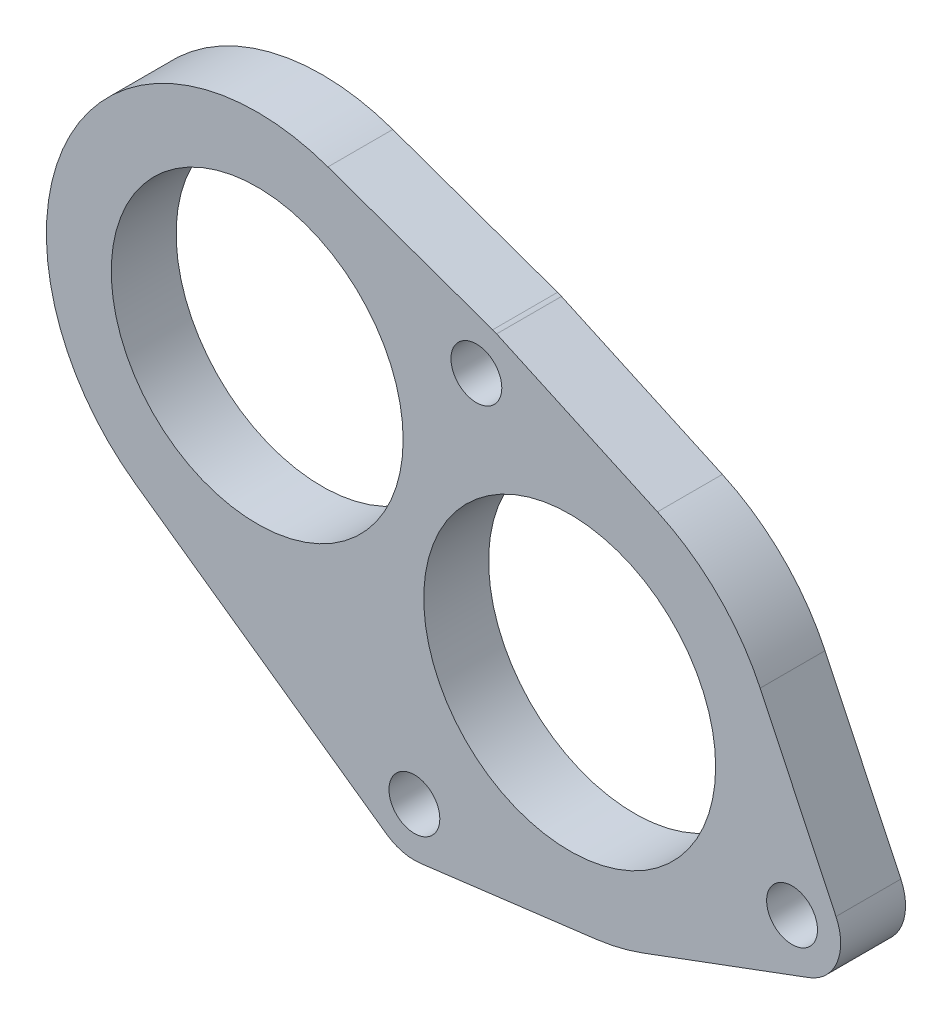
ISO-10303-21;
HEADER;
FILE_DESCRIPTION(('STEP AP214'),'2;1');
FILE_NAME('part.step','',(''),(''),'','','');
FILE_SCHEMA(('AUTOMOTIVE_DESIGN { 1 0 10303 214 1 1 1 1 }'));
ENDSEC;
DATA;
#1=APPLICATION_CONTEXT('core data for automotive mechanical design processes');
#2=APPLICATION_PROTOCOL_DEFINITION('international standard','automotive_design',2000,#1);
#3=PRODUCT_CONTEXT('',#1,'mechanical');
#4=PRODUCT('Part','Part','',(#3));
#5=PRODUCT_RELATED_PRODUCT_CATEGORY('part','',(#4));
#6=PRODUCT_DEFINITION_FORMATION('','',#4);
#7=PRODUCT_DEFINITION_CONTEXT('part definition',#1,'design');
#8=PRODUCT_DEFINITION('design','',#6,#7);
#9=PRODUCT_DEFINITION_SHAPE('','',#8);
#10=(LENGTH_UNIT() NAMED_UNIT(*) SI_UNIT(.MILLI.,.METRE.));
#11=(NAMED_UNIT(*) PLANE_ANGLE_UNIT() SI_UNIT($,.RADIAN.));
#12=(NAMED_UNIT(*) SI_UNIT($,.STERADIAN.) SOLID_ANGLE_UNIT());
#13=UNCERTAINTY_MEASURE_WITH_UNIT(LENGTH_MEASURE(1.E-05),#10,'distance_accuracy_value','');
#14=(GEOMETRIC_REPRESENTATION_CONTEXT(3) GLOBAL_UNCERTAINTY_ASSIGNED_CONTEXT((#13)) GLOBAL_UNIT_ASSIGNED_CONTEXT((#10,
#11,#12)) REPRESENTATION_CONTEXT('',''));
#15=CARTESIAN_POINT('',(0.,0.,0.));
#16=DIRECTION('',(0.,0.,1.));
#17=DIRECTION('',(1.,0.,0.));
#18=AXIS2_PLACEMENT_3D('',#15,#16,#17);
#19=CARTESIAN_POINT('',(458.923708871141,308.634202817224,6.35));
#20=DIRECTION('',(0.,0.,1.));
#21=DIRECTION('',(1.,0.,0.));
#22=AXIS2_PLACEMENT_3D('',#19,#20,#21);
#23=PLANE('',#22);
#24=CARTESIAN_POINT('',(511.280017293558,287.355993461718,6.35));
#25=DIRECTION('',(0.,0.,1.));
#26=DIRECTION('',(1.,0.,0.));
#27=AXIS2_PLACEMENT_3D('',#24,#25,#26);
#28=CIRCLE('',#27,2.48919999999983);
#29=CARTESIAN_POINT('',(513.769217293558,287.355993461718,6.35));
#30=VERTEX_POINT('',#29);
#31=EDGE_CURVE('E299',#30,#30,#28,.T.);
#32=ORIENTED_EDGE('',*,*,#31,.F.);
#33=EDGE_LOOP('',(#32));
#34=FACE_BOUND('',#33,.T.);
#35=CARTESIAN_POINT('',(458.923708871141,308.634202817224,6.35));
#36=DIRECTION('',(0.,0.,1.));
#37=DIRECTION('',(1.,0.,0.));
#38=AXIS2_PLACEMENT_3D('',#35,#36,#37);
#39=CIRCLE('',#38,14.2875000000001);
#40=CARTESIAN_POINT('',(473.211208871141,308.634202817224,6.35));
#41=VERTEX_POINT('',#40);
#42=EDGE_CURVE('E311',#41,#41,#39,.T.);
#43=ORIENTED_EDGE('',*,*,#42,.F.);
#44=EDGE_LOOP('',(#43));
#45=FACE_BOUND('',#44,.T.);
#46=CARTESIAN_POINT('',(458.923708871141,308.634202817224,6.35));
#47=DIRECTION('',(0.,0.,1.));
#48=DIRECTION('',(1.,0.,0.));
#49=AXIS2_PLACEMENT_3D('',#46,#47,#48);
#50=CIRCLE('',#49,20.6375000000002);
#51=CARTESIAN_POINT('',(465.844521394218,328.076650200988,6.35));
#52=VERTEX_POINT('',#51);
#53=CARTESIAN_POINT('',(446.998547845567,291.790897299477,6.35));
#54=VERTEX_POINT('',#53);
#55=EDGE_CURVE('E181',#52,#54,#50,.T.);
#56=ORIENTED_EDGE('',*,*,#55,.T.);
#57=DIRECTION('',(0.816150479357799,-0.577839419773379,0.));
#58=VECTOR('',#57,1.);
#59=CARTESIAN_POINT('',(446.998547845567,291.790897299477,6.35));
#60=LINE('',#59,#58);
#61=CARTESIAN_POINT('',(471.557949312387,274.40269420152,6.35));
#62=VERTEX_POINT('',#61);
#63=EDGE_CURVE('E109',#54,#62,#60,.T.);
#64=ORIENTED_EDGE('',*,*,#63,.T.);
#65=CARTESIAN_POINT('',(474.309909549058,278.289610859461,6.35));
#66=DIRECTION('',(0.,0.,1.));
#67=DIRECTION('',(1.,0.,0.));
#68=AXIS2_PLACEMENT_3D('',#65,#66,#67);
#69=CIRCLE('',#68,4.76250000000001);
#70=CARTESIAN_POINT('',(474.904236773766,273.56434034869,6.35));
#71=VERTEX_POINT('',#70);
#72=EDGE_CURVE('E208',#62,#71,#69,.T.);
#73=ORIENTED_EDGE('',*,*,#72,.T.);
#74=DIRECTION('',(0.992182784414036,0.124793118049078,0.));
#75=VECTOR('',#74,1.);
#76=CARTESIAN_POINT('',(474.904236773766,273.56434034869,6.35));
#77=LINE('',#76,#75);
#78=CARTESIAN_POINT('',(492.08932951865,275.725818396168,6.35));
#79=VERTEX_POINT('',#78);
#80=EDGE_CURVE('E227',#71,#79,#77,.T.);
#81=ORIENTED_EDGE('',*,*,#80,.T.);
#82=CARTESIAN_POINT('',(489.513911544912,296.201990609513,6.35));
#83=DIRECTION('',(0.,0.,1.));
#84=DIRECTION('',(1.,0.,0.));
#85=AXIS2_PLACEMENT_3D('',#82,#83,#84);
#86=CIRCLE('',#85,20.6375000000002);
#87=CARTESIAN_POINT('',(496.703937370517,276.85748402813,6.35));
#88=VERTEX_POINT('',#87);
#89=EDGE_CURVE('E224',#79,#88,#86,.T.);
#90=ORIENTED_EDGE('',*,*,#89,.T.);
#91=DIRECTION('',(0.93734738129047,0.348396163566562,0.));
#92=VECTOR('',#91,1.);
#93=CARTESIAN_POINT('',(496.703937370517,276.85748402813,6.35));
#94=LINE('',#93,#92);
#95=CARTESIAN_POINT('',(512.939254022543,282.891876558322,6.35));
#96=VERTEX_POINT('',#95);
#97=EDGE_CURVE('E226',#88,#96,#94,.T.);
#98=ORIENTED_EDGE('',*,*,#97,.T.);
#99=CARTESIAN_POINT('',(511.280017293558,287.355993461718,6.35));
#100=DIRECTION('',(0.,0.,1.));
#101=DIRECTION('',(1.,0.,0.));
#102=AXIS2_PLACEMENT_3D('',#99,#100,#101);
#103=CIRCLE('',#102,4.76249999999996);
#104=CARTESIAN_POINT('',(515.583008216685,289.396992081386,6.35));
#105=VERTEX_POINT('',#104);
#106=EDGE_CURVE('E229',#96,#105,#103,.T.);
#107=ORIENTED_EDGE('',*,*,#106,.T.);
#108=DIRECTION('',(-0.428556140612777,0.903515154462326,0.));
#109=VECTOR('',#108,1.);
#110=CARTESIAN_POINT('',(515.583008216685,289.396992081386,6.35));
#111=LINE('',#110,#109);
#112=CARTESIAN_POINT('',(508.160205545129,305.046317961409,6.35));
#113=VERTEX_POINT('',#112);
#114=EDGE_CURVE('E235',#105,#113,#111,.T.);
#115=ORIENTED_EDGE('',*,*,#114,.T.);
#116=CARTESIAN_POINT('',(489.513911544912,296.201990609513,6.35));
#117=DIRECTION('',(0.,0.,1.));
#118=DIRECTION('',(1.,0.,0.));
#119=AXIS2_PLACEMENT_3D('',#116,#117,#118);
#120=CIRCLE('',#119,20.6375000000002);
#121=CARTESIAN_POINT('',(498.108427309124,314.964738410107,6.35));
#122=VERTEX_POINT('',#121);
#123=EDGE_CURVE('E140',#113,#122,#120,.T.);
#124=ORIENTED_EDGE('',*,*,#123,.T.);
#125=DIRECTION('',(-0.909157979435234,0.416451399840656,0.));
#126=VECTOR('',#125,1.);
#127=CARTESIAN_POINT('',(498.108427309124,314.964738410107,6.35));
#128=LINE('',#127,#126);
#129=CARTESIAN_POINT('',(482.361364931325,322.177881031026,6.35));
#130=VERTEX_POINT('',#129);
#131=EDGE_CURVE('E134',#122,#130,#128,.T.);
#132=ORIENTED_EDGE('',*,*,#131,.T.);
#133=CARTESIAN_POINT('',(480.378015139584,317.848016153966,6.35));
#134=DIRECTION('',(0.,0.,1.));
#135=DIRECTION('',(1.,0.,0.));
#136=AXIS2_PLACEMENT_3D('',#133,#134,#135);
#137=CIRCLE('',#136,4.76249999999998);
#138=CARTESIAN_POINT('',(481.975125721833,322.334734780988,6.35));
#139=VERTEX_POINT('',#138);
#140=EDGE_CURVE('E138',#130,#139,#137,.T.);
#141=ORIENTED_EDGE('',*,*,#140,.T.);
#142=DIRECTION('',(-0.942093150030943,0.335351303359291,0.));
#143=VECTOR('',#142,1.);
#144=CARTESIAN_POINT('',(481.975125721833,322.334734780988,6.35));
#145=LINE('',#144,#143);
#146=EDGE_CURVE('E54',#139,#52,#145,.T.);
#147=ORIENTED_EDGE('',*,*,#146,.T.);
#148=EDGE_LOOP('',(#56,#64,#73,#81,#90,#98,#107,#115,#124,#132,#141,#147));
#149=FACE_BOUND('',#148,.T.);
#150=CARTESIAN_POINT('',(489.513911544912,296.201990609513,6.35));
#151=DIRECTION('',(0.,0.,1.));
#152=DIRECTION('',(1.,0.,0.));
#153=AXIS2_PLACEMENT_3D('',#150,#151,#152);
#154=CIRCLE('',#153,14.2875000000002);
#155=CARTESIAN_POINT('',(503.801411544913,296.201990609513,6.35));
#156=VERTEX_POINT('',#155);
#157=EDGE_CURVE('E162',#156,#156,#154,.T.);
#158=ORIENTED_EDGE('',*,*,#157,.F.);
#159=EDGE_LOOP('',(#158));
#160=FACE_BOUND('',#159,.T.);
#161=CARTESIAN_POINT('',(480.378015139584,317.848016153966,6.35));
#162=DIRECTION('',(0.,0.,1.));
#163=DIRECTION('',(1.,0.,0.));
#164=AXIS2_PLACEMENT_3D('',#161,#162,#163);
#165=CIRCLE('',#164,2.48919999999983);
#166=CARTESIAN_POINT('',(482.867215139584,317.848016153966,6.35));
#167=VERTEX_POINT('',#166);
#168=EDGE_CURVE('E305',#167,#167,#165,.T.);
#169=ORIENTED_EDGE('',*,*,#168,.F.);
#170=EDGE_LOOP('',(#169));
#171=FACE_BOUND('',#170,.T.);
#172=CARTESIAN_POINT('',(474.309909549058,278.289610859461,6.35));
#173=DIRECTION('',(0.,0.,1.));
#174=DIRECTION('',(1.,0.,0.));
#175=AXIS2_PLACEMENT_3D('',#172,#173,#174);
#176=CIRCLE('',#175,2.48919999999983);
#177=CARTESIAN_POINT('',(476.799109549057,278.289610859461,6.35));
#178=VERTEX_POINT('',#177);
#179=EDGE_CURVE('E290',#178,#178,#176,.T.);
#180=ORIENTED_EDGE('',*,*,#179,.F.);
#181=EDGE_LOOP('',(#180));
#182=FACE_BOUND('',#181,.T.);
#183=ADVANCED_FACE('F37',(#34,#45,#149,#160,#171,#182),#23,.T.);
#184=CARTESIAN_POINT('',(458.923708871141,308.634202817224,0.));
#185=DIRECTION('',(0.,0.,1.));
#186=DIRECTION('',(1.,0.,0.));
#187=AXIS2_PLACEMENT_3D('',#184,#185,#186);
#188=PLANE('',#187);
#189=CARTESIAN_POINT('',(458.923708871141,308.634202817224,0.));
#190=DIRECTION('',(0.,0.,1.));
#191=DIRECTION('',(1.,0.,0.));
#192=AXIS2_PLACEMENT_3D('',#189,#190,#191);
#193=CIRCLE('',#192,20.6375000000002);
#194=CARTESIAN_POINT('',(465.844521394218,328.076650200988,0.));
#195=VERTEX_POINT('',#194);
#196=CARTESIAN_POINT('',(446.998547845567,291.790897299477,0.));
#197=VERTEX_POINT('',#196);
#198=EDGE_CURVE('E158',#195,#197,#193,.T.);
#199=ORIENTED_EDGE('',*,*,#198,.F.);
#200=DIRECTION('',(-0.942093150030943,0.335351303359291,0.));
#201=VECTOR('',#200,1.);
#202=CARTESIAN_POINT('',(481.975125721833,322.334734780988,0.));
#203=LINE('',#202,#201);
#204=CARTESIAN_POINT('',(481.975125721833,322.334734780988,0.));
#205=VERTEX_POINT('',#204);
#206=EDGE_CURVE('E101',#205,#195,#203,.T.);
#207=ORIENTED_EDGE('',*,*,#206,.F.);
#208=CARTESIAN_POINT('',(480.378015139584,317.848016153966,0.));
#209=DIRECTION('',(0.,0.,1.));
#210=DIRECTION('',(1.,0.,0.));
#211=AXIS2_PLACEMENT_3D('',#208,#209,#210);
#212=CIRCLE('',#211,4.76249999999998);
#213=CARTESIAN_POINT('',(482.361364931325,322.177881031026,0.));
#214=VERTEX_POINT('',#213);
#215=EDGE_CURVE('E95',#214,#205,#212,.T.);
#216=ORIENTED_EDGE('',*,*,#215,.F.);
#217=DIRECTION('',(-0.909157979435234,0.416451399840656,0.));
#218=VECTOR('',#217,1.);
#219=CARTESIAN_POINT('',(498.108427309124,314.964738410107,0.));
#220=LINE('',#219,#218);
#221=CARTESIAN_POINT('',(498.108427309124,314.964738410107,0.));
#222=VERTEX_POINT('',#221);
#223=EDGE_CURVE('E148',#222,#214,#220,.T.);
#224=ORIENTED_EDGE('',*,*,#223,.F.);
#225=CARTESIAN_POINT('',(489.513911544912,296.201990609513,0.));
#226=DIRECTION('',(0.,0.,1.));
#227=DIRECTION('',(1.,0.,0.));
#228=AXIS2_PLACEMENT_3D('',#225,#226,#227);
#229=CIRCLE('',#228,20.6375000000002);
#230=CARTESIAN_POINT('',(508.160205545129,305.046317961409,0.));
#231=VERTEX_POINT('',#230);
#232=EDGE_CURVE('E176',#231,#222,#229,.T.);
#233=ORIENTED_EDGE('',*,*,#232,.F.);
#234=DIRECTION('',(-0.428556140612777,0.903515154462326,0.));
#235=VECTOR('',#234,1.);
#236=CARTESIAN_POINT('',(515.583008216685,289.396992081386,0.));
#237=LINE('',#236,#235);
#238=CARTESIAN_POINT('',(515.583008216685,289.396992081386,0.));
#239=VERTEX_POINT('',#238);
#240=EDGE_CURVE('E174',#239,#231,#237,.T.);
#241=ORIENTED_EDGE('',*,*,#240,.F.);
#242=CARTESIAN_POINT('',(511.280017293558,287.355993461718,0.));
#243=DIRECTION('',(0.,0.,1.));
#244=DIRECTION('',(1.,0.,0.));
#245=AXIS2_PLACEMENT_3D('',#242,#243,#244);
#246=CIRCLE('',#245,4.76249999999996);
#247=CARTESIAN_POINT('',(512.939254022543,282.891876558322,0.));
#248=VERTEX_POINT('',#247);
#249=EDGE_CURVE('E172',#248,#239,#246,.T.);
#250=ORIENTED_EDGE('',*,*,#249,.F.);
#251=DIRECTION('',(0.93734738129047,0.348396163566562,0.));
#252=VECTOR('',#251,1.);
#253=CARTESIAN_POINT('',(496.703937370517,276.85748402813,0.));
#254=LINE('',#253,#252);
#255=CARTESIAN_POINT('',(496.703937370517,276.85748402813,0.));
#256=VERTEX_POINT('',#255);
#257=EDGE_CURVE('E170',#256,#248,#254,.T.);
#258=ORIENTED_EDGE('',*,*,#257,.F.);
#259=CARTESIAN_POINT('',(489.513911544912,296.201990609513,0.));
#260=DIRECTION('',(0.,0.,1.));
#261=DIRECTION('',(1.,0.,0.));
#262=AXIS2_PLACEMENT_3D('',#259,#260,#261);
#263=CIRCLE('',#262,20.6375000000002);
#264=CARTESIAN_POINT('',(492.08932951865,275.725818396168,0.));
#265=VERTEX_POINT('',#264);
#266=EDGE_CURVE('E168',#265,#256,#263,.T.);
#267=ORIENTED_EDGE('',*,*,#266,.F.);
#268=DIRECTION('',(0.992182784414036,0.124793118049078,0.));
#269=VECTOR('',#268,1.);
#270=CARTESIAN_POINT('',(474.904236773766,273.56434034869,0.));
#271=LINE('',#270,#269);
#272=CARTESIAN_POINT('',(474.904236773766,273.56434034869,0.));
#273=VERTEX_POINT('',#272);
#274=EDGE_CURVE('E166',#273,#265,#271,.T.);
#275=ORIENTED_EDGE('',*,*,#274,.F.);
#276=CARTESIAN_POINT('',(474.309909549058,278.289610859461,0.));
#277=DIRECTION('',(0.,0.,1.));
#278=DIRECTION('',(1.,0.,0.));
#279=AXIS2_PLACEMENT_3D('',#276,#277,#278);
#280=CIRCLE('',#279,4.76250000000001);
#281=CARTESIAN_POINT('',(471.557949312387,274.40269420152,0.));
#282=VERTEX_POINT('',#281);
#283=EDGE_CURVE('E164',#282,#273,#280,.T.);
#284=ORIENTED_EDGE('',*,*,#283,.F.);
#285=DIRECTION('',(0.816150479357799,-0.577839419773379,0.));
#286=VECTOR('',#285,1.);
#287=CARTESIAN_POINT('',(446.998547845567,291.790897299477,0.));
#288=LINE('',#287,#286);
#289=EDGE_CURVE('E161',#197,#282,#288,.T.);
#290=ORIENTED_EDGE('',*,*,#289,.F.);
#291=EDGE_LOOP('',(#199,#207,#216,#224,#233,#241,#250,#258,#267,#275,#284,#290));
#292=FACE_BOUND('',#291,.T.);
#293=CARTESIAN_POINT('',(489.513911544912,296.201990609513,0.));
#294=DIRECTION('',(0.,0.,1.));
#295=DIRECTION('',(1.,0.,0.));
#296=AXIS2_PLACEMENT_3D('',#293,#294,#295);
#297=CIRCLE('',#296,14.2875000000002);
#298=CARTESIAN_POINT('',(503.801411544913,296.201990609513,0.));
#299=VERTEX_POINT('',#298);
#300=EDGE_CURVE('E314',#299,#299,#297,.T.);
#301=ORIENTED_EDGE('',*,*,#300,.T.);
#302=EDGE_LOOP('',(#301));
#303=FACE_BOUND('',#302,.T.);
#304=CARTESIAN_POINT('',(458.923708871141,308.634202817224,0.));
#305=DIRECTION('',(0.,0.,1.));
#306=DIRECTION('',(1.,0.,0.));
#307=AXIS2_PLACEMENT_3D('',#304,#305,#306);
#308=CIRCLE('',#307,14.2875000000001);
#309=CARTESIAN_POINT('',(473.211208871141,308.634202817224,0.));
#310=VERTEX_POINT('',#309);
#311=EDGE_CURVE('E308',#310,#310,#308,.T.);
#312=ORIENTED_EDGE('',*,*,#311,.T.);
#313=EDGE_LOOP('',(#312));
#314=FACE_BOUND('',#313,.T.);
#315=CARTESIAN_POINT('',(480.378015139584,317.848016153966,0.));
#316=DIRECTION('',(0.,0.,1.));
#317=DIRECTION('',(1.,0.,0.));
#318=AXIS2_PLACEMENT_3D('',#315,#316,#317);
#319=CIRCLE('',#318,2.48919999999983);
#320=CARTESIAN_POINT('',(482.867215139584,317.848016153966,0.));
#321=VERTEX_POINT('',#320);
#322=EDGE_CURVE('E302',#321,#321,#319,.T.);
#323=ORIENTED_EDGE('',*,*,#322,.T.);
#324=EDGE_LOOP('',(#323));
#325=FACE_BOUND('',#324,.T.);
#326=CARTESIAN_POINT('',(511.280017293558,287.355993461718,0.));
#327=DIRECTION('',(0.,0.,1.));
#328=DIRECTION('',(1.,0.,0.));
#329=AXIS2_PLACEMENT_3D('',#326,#327,#328);
#330=CIRCLE('',#329,2.48919999999983);
#331=CARTESIAN_POINT('',(513.769217293558,287.355993461718,0.));
#332=VERTEX_POINT('',#331);
#333=EDGE_CURVE('E296',#332,#332,#330,.T.);
#334=ORIENTED_EDGE('',*,*,#333,.T.);
#335=EDGE_LOOP('',(#334));
#336=FACE_BOUND('',#335,.T.);
#337=CARTESIAN_POINT('',(474.309909549058,278.289610859461,0.));
#338=DIRECTION('',(0.,0.,1.));
#339=DIRECTION('',(1.,0.,0.));
#340=AXIS2_PLACEMENT_3D('',#337,#338,#339);
#341=CIRCLE('',#340,2.48919999999983);
#342=CARTESIAN_POINT('',(476.799109549057,278.289610859461,0.));
#343=VERTEX_POINT('',#342);
#344=EDGE_CURVE('E293',#343,#343,#341,.T.);
#345=ORIENTED_EDGE('',*,*,#344,.T.);
#346=EDGE_LOOP('',(#345));
#347=FACE_BOUND('',#346,.T.);
#348=ADVANCED_FACE('F212',(#292,#303,#314,#325,#336,#347),#188,.F.);
#349=CARTESIAN_POINT('',(458.923708871141,308.634202817224,6.35));
#350=DIRECTION('',(0.,0.,-1.));
#351=DIRECTION('',(-1.,0.,0.));
#352=AXIS2_PLACEMENT_3D('',#349,#350,#351);
#353=CYLINDRICAL_SURFACE('',#352,20.6375000000002);
#354=ORIENTED_EDGE('',*,*,#198,.T.);
#355=DIRECTION('',(0.,0.,-1.));
#356=VECTOR('',#355,1.);
#357=CARTESIAN_POINT('',(446.998547845567,291.790897299477,6.35));
#358=LINE('',#357,#356);
#359=EDGE_CURVE('E11',#54,#197,#358,.T.);
#360=ORIENTED_EDGE('',*,*,#359,.F.);
#361=ORIENTED_EDGE('',*,*,#55,.F.);
#362=DIRECTION('',(0.,0.,-1.));
#363=VECTOR('',#362,1.);
#364=CARTESIAN_POINT('',(465.844521394218,328.076650200988,6.35));
#365=LINE('',#364,#363);
#366=EDGE_CURVE('E154',#52,#195,#365,.T.);
#367=ORIENTED_EDGE('',*,*,#366,.T.);
#368=EDGE_LOOP('',(#354,#360,#361,#367));
#369=FACE_BOUND('',#368,.T.);
#370=ADVANCED_FACE('F39',(#369),#353,.T.);
#371=CARTESIAN_POINT('',(446.998547845567,291.790897299477,6.35));
#372=DIRECTION('',(0.577839419773379,0.816150479357799,0.));
#373=DIRECTION('',(-0.816150479357799,0.577839419773379,0.));
#374=AXIS2_PLACEMENT_3D('',#371,#372,#373);
#375=PLANE('',#374);
#376=ORIENTED_EDGE('',*,*,#289,.T.);
#377=DIRECTION('',(0.,0.,-1.));
#378=VECTOR('',#377,1.);
#379=CARTESIAN_POINT('',(471.557949312387,274.40269420152,6.35));
#380=LINE('',#379,#378);
#381=EDGE_CURVE('E46',#62,#282,#380,.T.);
#382=ORIENTED_EDGE('',*,*,#381,.F.);
#383=ORIENTED_EDGE('',*,*,#63,.F.);
#384=ORIENTED_EDGE('',*,*,#359,.T.);
#385=EDGE_LOOP('',(#376,#382,#383,#384));
#386=FACE_BOUND('',#385,.T.);
#387=ADVANCED_FACE('F443',(#386),#375,.F.);
#388=CARTESIAN_POINT('',(474.309909549058,278.289610859461,6.35));
#389=DIRECTION('',(0.,0.,-1.));
#390=DIRECTION('',(-1.,0.,0.));
#391=AXIS2_PLACEMENT_3D('',#388,#389,#390);
#392=CYLINDRICAL_SURFACE('',#391,4.76250000000001);
#393=ORIENTED_EDGE('',*,*,#283,.T.);
#394=DIRECTION('',(0.,0.,-1.));
#395=VECTOR('',#394,1.);
#396=CARTESIAN_POINT('',(474.904236773766,273.56434034869,6.35));
#397=LINE('',#396,#395);
#398=EDGE_CURVE('E200',#71,#273,#397,.T.);
#399=ORIENTED_EDGE('',*,*,#398,.F.);
#400=ORIENTED_EDGE('',*,*,#72,.F.);
#401=ORIENTED_EDGE('',*,*,#381,.T.);
#402=EDGE_LOOP('',(#393,#399,#400,#401));
#403=FACE_BOUND('',#402,.T.);
#404=ADVANCED_FACE('F206',(#403),#392,.T.);
#405=CARTESIAN_POINT('',(474.904236773766,273.56434034869,6.35));
#406=DIRECTION('',(-0.124793118049078,0.992182784414036,0.));
#407=DIRECTION('',(-0.992182784414036,-0.124793118049078,0.));
#408=AXIS2_PLACEMENT_3D('',#405,#406,#407);
#409=PLANE('',#408);
#410=ORIENTED_EDGE('',*,*,#274,.T.);
#411=DIRECTION('',(0.,0.,-1.));
#412=VECTOR('',#411,1.);
#413=CARTESIAN_POINT('',(492.08932951865,275.725818396168,6.35));
#414=LINE('',#413,#412);
#415=EDGE_CURVE('E197',#79,#265,#414,.T.);
#416=ORIENTED_EDGE('',*,*,#415,.F.);
#417=ORIENTED_EDGE('',*,*,#80,.F.);
#418=ORIENTED_EDGE('',*,*,#398,.T.);
#419=EDGE_LOOP('',(#410,#416,#417,#418));
#420=FACE_BOUND('',#419,.T.);
#421=ADVANCED_FACE('F218',(#420),#409,.F.);
#422=CARTESIAN_POINT('',(489.513911544912,296.201990609513,6.35));
#423=DIRECTION('',(0.,0.,-1.));
#424=DIRECTION('',(-1.,0.,0.));
#425=AXIS2_PLACEMENT_3D('',#422,#423,#424);
#426=CYLINDRICAL_SURFACE('',#425,20.6375000000002);
#427=ORIENTED_EDGE('',*,*,#266,.T.);
#428=DIRECTION('',(0.,0.,-1.));
#429=VECTOR('',#428,1.);
#430=CARTESIAN_POINT('',(496.703937370517,276.85748402813,6.35));
#431=LINE('',#430,#429);
#432=EDGE_CURVE('E194',#88,#256,#431,.T.);
#433=ORIENTED_EDGE('',*,*,#432,.F.);
#434=ORIENTED_EDGE('',*,*,#89,.F.);
#435=ORIENTED_EDGE('',*,*,#415,.T.);
#436=EDGE_LOOP('',(#427,#433,#434,#435));
#437=FACE_BOUND('',#436,.T.);
#438=ADVANCED_FACE('F222',(#437),#426,.T.);
#439=CARTESIAN_POINT('',(496.703937370517,276.85748402813,6.35));
#440=DIRECTION('',(-0.348396163566562,0.93734738129047,0.));
#441=DIRECTION('',(-0.93734738129047,-0.348396163566562,0.));
#442=AXIS2_PLACEMENT_3D('',#439,#440,#441);
#443=PLANE('',#442);
#444=ORIENTED_EDGE('',*,*,#257,.T.);
#445=DIRECTION('',(0.,0.,-1.));
#446=VECTOR('',#445,1.);
#447=CARTESIAN_POINT('',(512.939254022543,282.891876558322,6.35));
#448=LINE('',#447,#446);
#449=EDGE_CURVE('E191',#96,#248,#448,.T.);
#450=ORIENTED_EDGE('',*,*,#449,.F.);
#451=ORIENTED_EDGE('',*,*,#97,.F.);
#452=ORIENTED_EDGE('',*,*,#432,.T.);
#453=EDGE_LOOP('',(#444,#450,#451,#452));
#454=FACE_BOUND('',#453,.T.);
#455=ADVANCED_FACE('F404',(#454),#443,.F.);
#456=CARTESIAN_POINT('',(511.280017293558,287.355993461718,6.35));
#457=DIRECTION('',(0.,0.,-1.));
#458=DIRECTION('',(-1.,0.,0.));
#459=AXIS2_PLACEMENT_3D('',#456,#457,#458);
#460=CYLINDRICAL_SURFACE('',#459,4.76249999999996);
#461=ORIENTED_EDGE('',*,*,#249,.T.);
#462=DIRECTION('',(0.,0.,-1.));
#463=VECTOR('',#462,1.);
#464=CARTESIAN_POINT('',(515.583008216685,289.396992081386,6.35));
#465=LINE('',#464,#463);
#466=EDGE_CURVE('E188',#105,#239,#465,.T.);
#467=ORIENTED_EDGE('',*,*,#466,.F.);
#468=ORIENTED_EDGE('',*,*,#106,.F.);
#469=ORIENTED_EDGE('',*,*,#449,.T.);
#470=EDGE_LOOP('',(#461,#467,#468,#469));
#471=FACE_BOUND('',#470,.T.);
#472=ADVANCED_FACE('F394',(#471),#460,.T.);
#473=CARTESIAN_POINT('',(515.583008216685,289.396992081386,6.35));
#474=DIRECTION('',(-0.903515154462326,-0.428556140612777,0.));
#475=DIRECTION('',(0.428556140612777,-0.903515154462326,0.));
#476=AXIS2_PLACEMENT_3D('',#473,#474,#475);
#477=PLANE('',#476);
#478=ORIENTED_EDGE('',*,*,#240,.T.);
#479=DIRECTION('',(0.,0.,-1.));
#480=VECTOR('',#479,1.);
#481=CARTESIAN_POINT('',(508.160205545129,305.046317961409,6.35));
#482=LINE('',#481,#480);
#483=EDGE_CURVE('E185',#113,#231,#482,.T.);
#484=ORIENTED_EDGE('',*,*,#483,.F.);
#485=ORIENTED_EDGE('',*,*,#114,.F.);
#486=ORIENTED_EDGE('',*,*,#466,.T.);
#487=EDGE_LOOP('',(#478,#484,#485,#486));
#488=FACE_BOUND('',#487,.T.);
#489=ADVANCED_FACE('F241',(#488),#477,.F.);
#490=CARTESIAN_POINT('',(489.513911544912,296.201990609513,6.35));
#491=DIRECTION('',(0.,0.,-1.));
#492=DIRECTION('',(-1.,0.,0.));
#493=AXIS2_PLACEMENT_3D('',#490,#491,#492);
#494=CYLINDRICAL_SURFACE('',#493,20.6375000000002);
#495=ORIENTED_EDGE('',*,*,#232,.T.);
#496=DIRECTION('',(0.,0.,-1.));
#497=VECTOR('',#496,1.);
#498=CARTESIAN_POINT('',(498.108427309124,314.964738410107,6.35));
#499=LINE('',#498,#497);
#500=EDGE_CURVE('E149',#122,#222,#499,.T.);
#501=ORIENTED_EDGE('',*,*,#500,.F.);
#502=ORIENTED_EDGE('',*,*,#123,.F.);
#503=ORIENTED_EDGE('',*,*,#483,.T.);
#504=EDGE_LOOP('',(#495,#501,#502,#503));
#505=FACE_BOUND('',#504,.T.);
#506=ADVANCED_FACE('F245',(#505),#494,.T.);
#507=CARTESIAN_POINT('',(498.108427309124,314.964738410107,6.35));
#508=DIRECTION('',(-0.416451399840656,-0.909157979435234,0.));
#509=DIRECTION('',(0.909157979435235,-0.416451399840656,0.));
#510=AXIS2_PLACEMENT_3D('',#507,#508,#509);
#511=PLANE('',#510);
#512=ORIENTED_EDGE('',*,*,#223,.T.);
#513=DIRECTION('',(0.,0.,-1.));
#514=VECTOR('',#513,1.);
#515=CARTESIAN_POINT('',(482.361364931325,322.177881031026,6.35));
#516=LINE('',#515,#514);
#517=EDGE_CURVE('E145',#130,#214,#516,.T.);
#518=ORIENTED_EDGE('',*,*,#517,.F.);
#519=ORIENTED_EDGE('',*,*,#131,.F.);
#520=ORIENTED_EDGE('',*,*,#500,.T.);
#521=EDGE_LOOP('',(#512,#518,#519,#520));
#522=FACE_BOUND('',#521,.T.);
#523=ADVANCED_FACE('F146',(#522),#511,.F.);
#524=CARTESIAN_POINT('',(480.378015139584,317.848016153966,6.35));
#525=DIRECTION('',(0.,0.,-1.));
#526=DIRECTION('',(-1.,0.,0.));
#527=AXIS2_PLACEMENT_3D('',#524,#525,#526);
#528=CYLINDRICAL_SURFACE('',#527,4.76249999999998);
#529=ORIENTED_EDGE('',*,*,#215,.T.);
#530=DIRECTION('',(0.,0.,-1.));
#531=VECTOR('',#530,1.);
#532=CARTESIAN_POINT('',(481.975125721833,322.334734780988,6.35));
#533=LINE('',#532,#531);
#534=EDGE_CURVE('E150',#139,#205,#533,.T.);
#535=ORIENTED_EDGE('',*,*,#534,.F.);
#536=ORIENTED_EDGE('',*,*,#140,.F.);
#537=ORIENTED_EDGE('',*,*,#517,.T.);
#538=EDGE_LOOP('',(#529,#535,#536,#537));
#539=FACE_BOUND('',#538,.T.);
#540=ADVANCED_FACE('F152',(#539),#528,.T.);
#541=CARTESIAN_POINT('',(481.975125721833,322.334734780988,6.35));
#542=DIRECTION('',(-0.335351303359291,-0.942093150030943,0.));
#543=DIRECTION('',(0.942093150030943,-0.335351303359291,0.));
#544=AXIS2_PLACEMENT_3D('',#541,#542,#543);
#545=PLANE('',#544);
#546=ORIENTED_EDGE('',*,*,#206,.T.);
#547=ORIENTED_EDGE('',*,*,#366,.F.);
#548=ORIENTED_EDGE('',*,*,#146,.F.);
#549=ORIENTED_EDGE('',*,*,#534,.T.);
#550=EDGE_LOOP('',(#546,#547,#548,#549));
#551=FACE_BOUND('',#550,.T.);
#552=ADVANCED_FACE('F249',(#551),#545,.F.);
#553=CARTESIAN_POINT('',(489.513911544912,296.201990609513,6.35));
#554=DIRECTION('',(0.,0.,-1.));
#555=DIRECTION('',(-1.,0.,0.));
#556=AXIS2_PLACEMENT_3D('',#553,#554,#555);
#557=CYLINDRICAL_SURFACE('',#556,14.2875000000002);
#558=ORIENTED_EDGE('',*,*,#157,.T.);
#559=EDGE_LOOP('',(#558));
#560=FACE_BOUND('',#559,.T.);
#561=ORIENTED_EDGE('',*,*,#300,.F.);
#562=EDGE_LOOP('',(#561));
#563=FACE_BOUND('',#562,.T.);
#564=ADVANCED_FACE('F251',(#560,#563),#557,.F.);
#565=CARTESIAN_POINT('',(458.923708871141,308.634202817224,6.35));
#566=DIRECTION('',(0.,0.,-1.));
#567=DIRECTION('',(-1.,0.,0.));
#568=AXIS2_PLACEMENT_3D('',#565,#566,#567);
#569=CYLINDRICAL_SURFACE('',#568,14.2875000000001);
#570=ORIENTED_EDGE('',*,*,#42,.T.);
#571=EDGE_LOOP('',(#570));
#572=FACE_BOUND('',#571,.T.);
#573=ORIENTED_EDGE('',*,*,#311,.F.);
#574=EDGE_LOOP('',(#573));
#575=FACE_BOUND('',#574,.T.);
#576=ADVANCED_FACE('F257',(#572,#575),#569,.F.);
#577=CARTESIAN_POINT('',(480.378015139584,317.848016153966,6.35));
#578=DIRECTION('',(0.,0.,-1.));
#579=DIRECTION('',(-1.,0.,0.));
#580=AXIS2_PLACEMENT_3D('',#577,#578,#579);
#581=CYLINDRICAL_SURFACE('',#580,2.48919999999983);
#582=ORIENTED_EDGE('',*,*,#168,.T.);
#583=EDGE_LOOP('',(#582));
#584=FACE_BOUND('',#583,.T.);
#585=ORIENTED_EDGE('',*,*,#322,.F.);
#586=EDGE_LOOP('',(#585));
#587=FACE_BOUND('',#586,.T.);
#588=ADVANCED_FACE('F273',(#584,#587),#581,.F.);
#589=CARTESIAN_POINT('',(511.280017293558,287.355993461718,6.35));
#590=DIRECTION('',(0.,0.,-1.));
#591=DIRECTION('',(-1.,0.,0.));
#592=AXIS2_PLACEMENT_3D('',#589,#590,#591);
#593=CYLINDRICAL_SURFACE('',#592,2.48919999999983);
#594=ORIENTED_EDGE('',*,*,#31,.T.);
#595=EDGE_LOOP('',(#594));
#596=FACE_BOUND('',#595,.T.);
#597=ORIENTED_EDGE('',*,*,#333,.F.);
#598=EDGE_LOOP('',(#597));
#599=FACE_BOUND('',#598,.T.);
#600=ADVANCED_FACE('F277',(#596,#599),#593,.F.);
#601=CARTESIAN_POINT('',(474.309909549058,278.289610859461,6.35));
#602=DIRECTION('',(0.,0.,-1.));
#603=DIRECTION('',(-1.,0.,0.));
#604=AXIS2_PLACEMENT_3D('',#601,#602,#603);
#605=CYLINDRICAL_SURFACE('',#604,2.48919999999983);
#606=ORIENTED_EDGE('',*,*,#179,.T.);
#607=EDGE_LOOP('',(#606));
#608=FACE_BOUND('',#607,.T.);
#609=ORIENTED_EDGE('',*,*,#344,.F.);
#610=EDGE_LOOP('',(#609));
#611=FACE_BOUND('',#610,.T.);
#612=ADVANCED_FACE('F281',(#608,#611),#605,.F.);
#613=CLOSED_SHELL('',(#183,#348,#370,#387,#404,#421,#438,#455,#472,#489,#506,#523,#540,#552,
#564,#576,#588,#600,#612));
#614=MANIFOLD_SOLID_BREP('B2',#613);
#615=ADVANCED_BREP_SHAPE_REPRESENTATION('',(#18,#614),#14);
#616=SHAPE_DEFINITION_REPRESENTATION(#9,#615);
ENDSEC;
END-ISO-10303-21;
